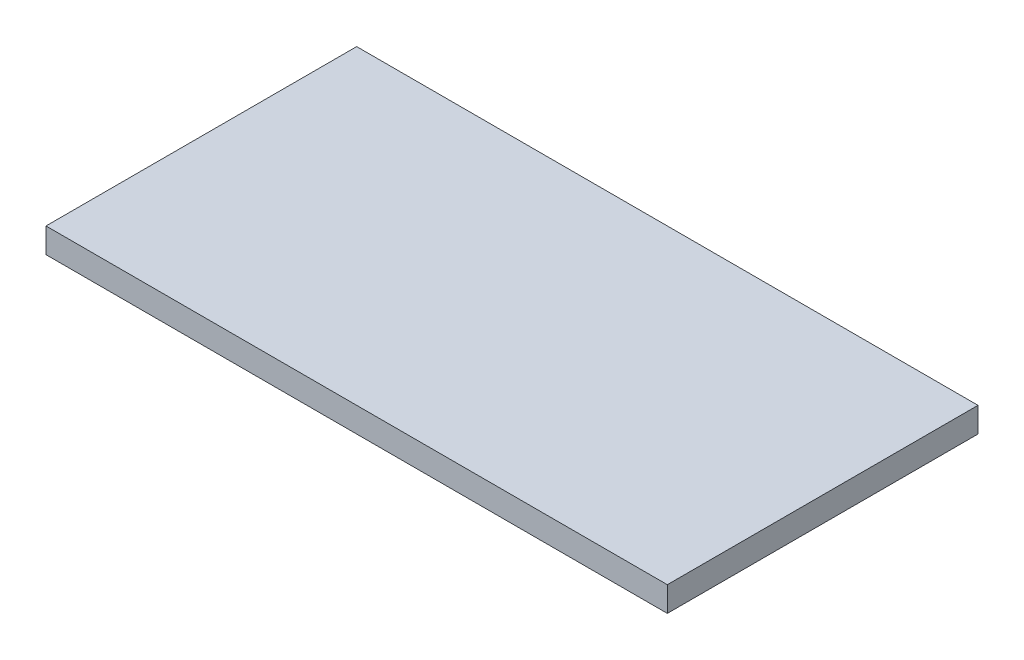
ISO-10303-21;
HEADER;
FILE_DESCRIPTION(('STEP AP214'),'2;1');
FILE_NAME('part.step','',(''),(''),'','','');
FILE_SCHEMA(('AUTOMOTIVE_DESIGN { 1 0 10303 214 1 1 1 1 }'));
ENDSEC;
DATA;
#1=APPLICATION_CONTEXT('core data for automotive mechanical design processes');
#2=APPLICATION_PROTOCOL_DEFINITION('international standard','automotive_design',2000,#1);
#3=PRODUCT_CONTEXT('',#1,'mechanical');
#4=PRODUCT('Part','Part','',(#3));
#5=PRODUCT_RELATED_PRODUCT_CATEGORY('part','',(#4));
#6=PRODUCT_DEFINITION_FORMATION('','',#4);
#7=PRODUCT_DEFINITION_CONTEXT('part definition',#1,'design');
#8=PRODUCT_DEFINITION('design','',#6,#7);
#9=PRODUCT_DEFINITION_SHAPE('','',#8);
#10=(LENGTH_UNIT() NAMED_UNIT(*) SI_UNIT(.MILLI.,.METRE.));
#11=(NAMED_UNIT(*) PLANE_ANGLE_UNIT() SI_UNIT($,.RADIAN.));
#12=(NAMED_UNIT(*) SI_UNIT($,.STERADIAN.) SOLID_ANGLE_UNIT());
#13=UNCERTAINTY_MEASURE_WITH_UNIT(LENGTH_MEASURE(1.E-05),#10,'distance_accuracy_value','');
#14=(GEOMETRIC_REPRESENTATION_CONTEXT(3) GLOBAL_UNCERTAINTY_ASSIGNED_CONTEXT((#13)) GLOBAL_UNIT_ASSIGNED_CONTEXT((#10,
#11,#12)) REPRESENTATION_CONTEXT('',''));
#15=CARTESIAN_POINT('',(0.,0.,0.));
#16=DIRECTION('',(0.,0.,1.));
#17=DIRECTION('',(1.,0.,0.));
#18=AXIS2_PLACEMENT_3D('',#15,#16,#17);
#19=CARTESIAN_POINT('',(-46.2711864406779,4.00484151740666,-16.7796610169492));
#20=DIRECTION('',(1.,0.,0.));
#21=DIRECTION('',(0.,0.,-1.));
#22=AXIS2_PLACEMENT_3D('',#19,#20,#21);
#23=PLANE('',#22);
#24=DIRECTION('',(0.,0.,1.));
#25=VECTOR('',#24,1.);
#26=CARTESIAN_POINT('',(-46.2711864406779,0.,-16.7796610169492));
#27=LINE('',#26,#25);
#28=CARTESIAN_POINT('',(-46.2711864406779,0.,-16.7796610169492));
#29=VERTEX_POINT('',#28);
#30=CARTESIAN_POINT('',(-46.2711864406779,0.,33.2203389830509));
#31=VERTEX_POINT('',#30);
#32=EDGE_CURVE('E99',#29,#31,#27,.T.);
#33=ORIENTED_EDGE('',*,*,#32,.T.);
#34=DIRECTION('',(0.,-1.,0.));
#35=VECTOR('',#34,1.);
#36=CARTESIAN_POINT('',(-46.2711864406779,4.00484151740666,33.2203389830509));
#37=LINE('',#36,#35);
#38=CARTESIAN_POINT('',(-46.2711864406779,4.00484151740666,33.2203389830509));
#39=VERTEX_POINT('',#38);
#40=EDGE_CURVE('E11',#39,#31,#37,.T.);
#41=ORIENTED_EDGE('',*,*,#40,.F.);
#42=DIRECTION('',(0.,0.,1.));
#43=VECTOR('',#42,1.);
#44=CARTESIAN_POINT('',(-46.2711864406779,4.00484151740666,-16.7796610169492));
#45=LINE('',#44,#43);
#46=CARTESIAN_POINT('',(-46.2711864406779,4.00484151740666,-16.7796610169492));
#47=VERTEX_POINT('',#46);
#48=EDGE_CURVE('E87',#47,#39,#45,.T.);
#49=ORIENTED_EDGE('',*,*,#48,.F.);
#50=DIRECTION('',(0.,-1.,0.));
#51=VECTOR('',#50,1.);
#52=CARTESIAN_POINT('',(-46.2711864406779,4.00484151740666,-16.7796610169492));
#53=LINE('',#52,#51);
#54=EDGE_CURVE('E95',#47,#29,#53,.T.);
#55=ORIENTED_EDGE('',*,*,#54,.T.);
#56=EDGE_LOOP('',(#33,#41,#49,#55));
#57=FACE_BOUND('',#56,.T.);
#58=ADVANCED_FACE('F36',(#57),#23,.F.);
#59=CARTESIAN_POINT('',(-46.2711864406779,4.00484151740666,33.2203389830509));
#60=DIRECTION('',(0.,0.,-1.));
#61=DIRECTION('',(-1.,0.,0.));
#62=AXIS2_PLACEMENT_3D('',#59,#60,#61);
#63=PLANE('',#62);
#64=DIRECTION('',(1.,0.,0.));
#65=VECTOR('',#64,1.);
#66=CARTESIAN_POINT('',(-46.2711864406779,0.,33.2203389830509));
#67=LINE('',#66,#65);
#68=CARTESIAN_POINT('',(53.7288135593221,0.,33.2203389830509));
#69=VERTEX_POINT('',#68);
#70=EDGE_CURVE('E91',#31,#69,#67,.T.);
#71=ORIENTED_EDGE('',*,*,#70,.T.);
#72=DIRECTION('',(0.,-1.,0.));
#73=VECTOR('',#72,1.);
#74=CARTESIAN_POINT('',(53.7288135593221,4.00484151740666,33.2203389830509));
#75=LINE('',#74,#73);
#76=CARTESIAN_POINT('',(53.7288135593221,4.00484151740666,33.2203389830509));
#77=VERTEX_POINT('',#76);
#78=EDGE_CURVE('E44',#77,#69,#75,.T.);
#79=ORIENTED_EDGE('',*,*,#78,.F.);
#80=DIRECTION('',(1.,0.,0.));
#81=VECTOR('',#80,1.);
#82=CARTESIAN_POINT('',(-46.2711864406779,4.00484151740666,33.2203389830509));
#83=LINE('',#82,#81);
#84=EDGE_CURVE('E82',#39,#77,#83,.T.);
#85=ORIENTED_EDGE('',*,*,#84,.F.);
#86=ORIENTED_EDGE('',*,*,#40,.T.);
#87=EDGE_LOOP('',(#71,#79,#85,#86));
#88=FACE_BOUND('',#87,.T.);
#89=ADVANCED_FACE('F90',(#88),#63,.F.);
#90=CARTESIAN_POINT('',(53.7288135593221,4.00484151740666,-16.7796610169492));
#91=DIRECTION('',(-1.,0.,0.));
#92=DIRECTION('',(0.,0.,1.));
#93=AXIS2_PLACEMENT_3D('',#90,#91,#92);
#94=PLANE('',#93);
#95=DIRECTION('',(0.,0.,-1.));
#96=VECTOR('',#95,1.);
#97=CARTESIAN_POINT('',(53.7288135593221,0.,-16.7796610169492));
#98=LINE('',#97,#96);
#99=CARTESIAN_POINT('',(53.7288135593221,0.,-16.7796610169492));
#100=VERTEX_POINT('',#99);
#101=EDGE_CURVE('E69',#69,#100,#98,.T.);
#102=ORIENTED_EDGE('',*,*,#101,.T.);
#103=DIRECTION('',(0.,-1.,0.));
#104=VECTOR('',#103,1.);
#105=CARTESIAN_POINT('',(53.7288135593221,4.00484151740666,-16.7796610169492));
#106=LINE('',#105,#104);
#107=CARTESIAN_POINT('',(53.7288135593221,4.00484151740666,-16.7796610169492));
#108=VERTEX_POINT('',#107);
#109=EDGE_CURVE('E92',#108,#100,#106,.T.);
#110=ORIENTED_EDGE('',*,*,#109,.F.);
#111=DIRECTION('',(0.,0.,-1.));
#112=VECTOR('',#111,1.);
#113=CARTESIAN_POINT('',(53.7288135593221,4.00484151740666,-16.7796610169492));
#114=LINE('',#113,#112);
#115=EDGE_CURVE('E85',#77,#108,#114,.T.);
#116=ORIENTED_EDGE('',*,*,#115,.F.);
#117=ORIENTED_EDGE('',*,*,#78,.T.);
#118=EDGE_LOOP('',(#102,#110,#116,#117));
#119=FACE_BOUND('',#118,.T.);
#120=ADVANCED_FACE('F93',(#119),#94,.F.);
#121=CARTESIAN_POINT('',(-46.2711864406779,4.00484151740666,-16.7796610169492));
#122=DIRECTION('',(0.,0.,1.));
#123=DIRECTION('',(1.,0.,0.));
#124=AXIS2_PLACEMENT_3D('',#121,#122,#123);
#125=PLANE('',#124);
#126=DIRECTION('',(-1.,0.,0.));
#127=VECTOR('',#126,1.);
#128=CARTESIAN_POINT('',(-46.2711864406779,0.,-16.7796610169492));
#129=LINE('',#128,#127);
#130=EDGE_CURVE('E75',#100,#29,#129,.T.);
#131=ORIENTED_EDGE('',*,*,#130,.T.);
#132=ORIENTED_EDGE('',*,*,#54,.F.);
#133=DIRECTION('',(-1.,0.,0.));
#134=VECTOR('',#133,1.);
#135=CARTESIAN_POINT('',(-46.2711864406779,4.00484151740666,-16.7796610169492));
#136=LINE('',#135,#134);
#137=EDGE_CURVE('E52',#108,#47,#136,.T.);
#138=ORIENTED_EDGE('',*,*,#137,.F.);
#139=ORIENTED_EDGE('',*,*,#109,.T.);
#140=EDGE_LOOP('',(#131,#132,#138,#139));
#141=FACE_BOUND('',#140,.T.);
#142=ADVANCED_FACE('F106',(#141),#125,.F.);
#143=CARTESIAN_POINT('',(0.,4.00484151740666,0.));
#144=DIRECTION('',(0.,1.,0.));
#145=DIRECTION('',(0.,0.,1.));
#146=AXIS2_PLACEMENT_3D('',#143,#144,#145);
#147=PLANE('',#146);
#148=ORIENTED_EDGE('',*,*,#48,.T.);
#149=ORIENTED_EDGE('',*,*,#84,.T.);
#150=ORIENTED_EDGE('',*,*,#115,.T.);
#151=ORIENTED_EDGE('',*,*,#137,.T.);
#152=EDGE_LOOP('',(#148,#149,#150,#151));
#153=FACE_BOUND('',#152,.T.);
#154=ADVANCED_FACE('F83',(#153),#147,.T.);
#155=CARTESIAN_POINT('',(0.,0.,0.));
#156=DIRECTION('',(0.,1.,0.));
#157=DIRECTION('',(0.,0.,1.));
#158=AXIS2_PLACEMENT_3D('',#155,#156,#157);
#159=PLANE('',#158);
#160=ORIENTED_EDGE('',*,*,#32,.F.);
#161=ORIENTED_EDGE('',*,*,#130,.F.);
#162=ORIENTED_EDGE('',*,*,#101,.F.);
#163=ORIENTED_EDGE('',*,*,#70,.F.);
#164=EDGE_LOOP('',(#160,#161,#162,#163));
#165=FACE_BOUND('',#164,.T.);
#166=ADVANCED_FACE('F109',(#165),#159,.F.);
#167=CLOSED_SHELL('',(#58,#89,#120,#142,#154,#166));
#168=MANIFOLD_SOLID_BREP('B2',#167);
#169=ADVANCED_BREP_SHAPE_REPRESENTATION('',(#18,#168),#14);
#170=SHAPE_DEFINITION_REPRESENTATION(#9,#169);
ENDSEC;
END-ISO-10303-21;
